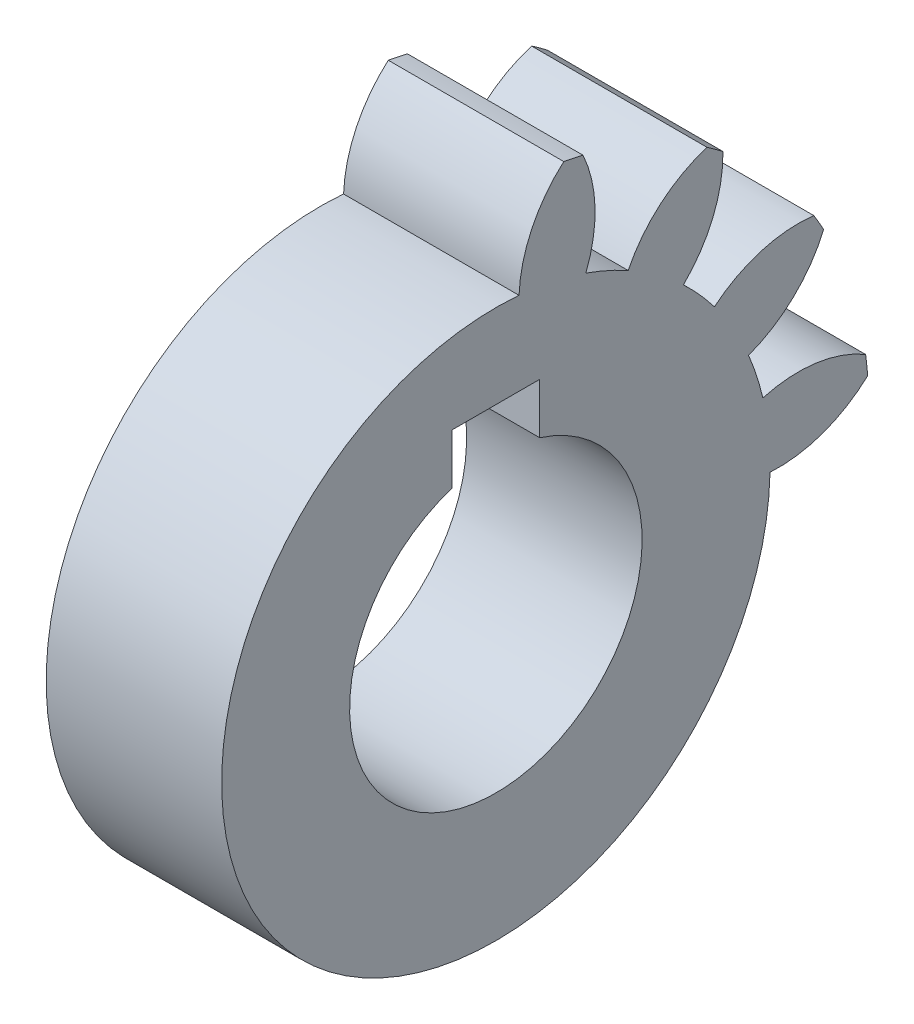
ISO-10303-21;
HEADER;
FILE_DESCRIPTION(('STEP AP214'),'2;1');
FILE_NAME('part.step','',(''),(''),'','','');
FILE_SCHEMA(('AUTOMOTIVE_DESIGN { 1 0 10303 214 1 1 1 1 }'));
ENDSEC;
DATA;
#1=APPLICATION_CONTEXT('core data for automotive mechanical design processes');
#2=APPLICATION_PROTOCOL_DEFINITION('international standard','automotive_design',2000,#1);
#3=PRODUCT_CONTEXT('',#1,'mechanical');
#4=PRODUCT('Part','Part','',(#3));
#5=PRODUCT_RELATED_PRODUCT_CATEGORY('part','',(#4));
#6=PRODUCT_DEFINITION_FORMATION('','',#4);
#7=PRODUCT_DEFINITION_CONTEXT('part definition',#1,'design');
#8=PRODUCT_DEFINITION('design','',#6,#7);
#9=PRODUCT_DEFINITION_SHAPE('','',#8);
#10=(LENGTH_UNIT() NAMED_UNIT(*) SI_UNIT(.MILLI.,.METRE.));
#11=(NAMED_UNIT(*) PLANE_ANGLE_UNIT() SI_UNIT($,.RADIAN.));
#12=(NAMED_UNIT(*) SI_UNIT($,.STERADIAN.) SOLID_ANGLE_UNIT());
#13=UNCERTAINTY_MEASURE_WITH_UNIT(LENGTH_MEASURE(1.E-05),#10,'distance_accuracy_value','');
#14=(GEOMETRIC_REPRESENTATION_CONTEXT(3) GLOBAL_UNCERTAINTY_ASSIGNED_CONTEXT((#13)) GLOBAL_UNIT_ASSIGNED_CONTEXT((#10,
#11,#12)) REPRESENTATION_CONTEXT('',''));
#15=CARTESIAN_POINT('',(0.,0.,0.));
#16=DIRECTION('',(0.,0.,1.));
#17=DIRECTION('',(1.,0.,0.));
#18=AXIS2_PLACEMENT_3D('',#15,#16,#17);
#19=CARTESIAN_POINT('',(12.,0.,0.));
#20=DIRECTION('',(-1.,0.,0.));
#21=DIRECTION('',(0.,0.,1.));
#22=AXIS2_PLACEMENT_3D('',#19,#20,#21);
#23=PLANE('',#22);
#24=CARTESIAN_POINT('',(12.,0.,0.));
#25=DIRECTION('',(-1.,0.,0.));
#26=DIRECTION('',(0.,0.,-1.));
#27=AXIS2_PLACEMENT_3D('',#24,#25,#26);
#28=CIRCLE('',#27,18.7490000000188);
#29=CARTESIAN_POINT('',(12.,-0.376878329068281,-18.7452117546264));
#30=VERTEX_POINT('',#29);
#31=CARTESIAN_POINT('',(12.,18.681918035867,-1.58459442818945));
#32=VERTEX_POINT('',#31);
#33=EDGE_CURVE('E276',#30,#32,#28,.T.);
#34=ORIENTED_EDGE('',*,*,#33,.F.);
#35=CARTESIAN_POINT('',(12.,8.60521268905633,-19.3126982674945));
#36=DIRECTION('',(-1.,0.,0.));
#37=DIRECTION('',(0.,-0.994521895368274,0.104528463267644));
#38=AXIS2_PLACEMENT_3D('',#35,#36,#37);
#39=CIRCLE('',#38,9.000000000009);
#40=CARTESIAN_POINT('',(12.,1.99616591323329,-25.4217489887723));
#41=VERTEX_POINT('',#40);
#42=EDGE_CURVE('E237',#41,#30,#39,.T.);
#43=ORIENTED_EDGE('',*,*,#42,.F.);
#44=CARTESIAN_POINT('',(12.,0.,0.));
#45=DIRECTION('',(-1.,0.,0.));
#46=DIRECTION('',(0.,0.,1.));
#47=AXIS2_PLACEMENT_3D('',#44,#45,#46);
#48=CIRCLE('',#47,25.5000000000255);
#49=CARTESIAN_POINT('',(12.,3.33293391710508,-25.2812490099977));
#50=VERTEX_POINT('',#49);
#51=EDGE_CURVE('E291',#50,#41,#48,.T.);
#52=ORIENTED_EDGE('',*,*,#51,.F.);
#53=CARTESIAN_POINT('',(12.,-4.40183239455614,-20.6797937940739));
#54=DIRECTION('',(-1.,0.,0.));
#55=DIRECTION('',(0.,-0.95105651629515,-0.309016994374957));
#56=AXIS2_PLACEMENT_3D('',#53,#54,#55);
#57=CIRCLE('',#56,9.000000000009);
#58=CARTESIAN_POINT('',(12.,4.26599130398838,-18.2572264924056));
#59=VERTEX_POINT('',#58);
#60=EDGE_CURVE('E245',#59,#50,#57,.T.);
#61=ORIENTED_EDGE('',*,*,#60,.F.);
#62=CARTESIAN_POINT('',(12.,0.,0.));
#63=DIRECTION('',(-1.,0.,0.));
#64=DIRECTION('',(0.,-0.95105651629515,-0.309016994374957));
#65=AXIS2_PLACEMENT_3D('',#62,#63,#64);
#66=CIRCLE('',#65,18.7490000000188);
#67=CARTESIAN_POINT('',(12.,7.2800690172175,-17.2778932774008));
#68=VERTEX_POINT('',#67);
#69=EDGE_CURVE('E250',#68,#59,#66,.T.);
#70=ORIENTED_EDGE('',*,*,#69,.F.);
#71=CARTESIAN_POINT('',(12.,15.7164350261924,-14.1429724549917));
#72=DIRECTION('',(-1.,0.,0.));
#73=DIRECTION('',(0.,-0.95105651629515,-0.309016994374957));
#74=AXIS2_PLACEMENT_3D('',#71,#72,#73);
#75=CIRCLE('',#74,9.000000000009);
#76=CARTESIAN_POINT('',(12.,12.1635451475441,-22.4120094914525));
#77=VERTEX_POINT('',#76);
#78=EDGE_CURVE('E247',#77,#68,#75,.T.);
#79=ORIENTED_EDGE('',*,*,#78,.F.);
#80=CARTESIAN_POINT('',(12.,13.3275969956842,-21.7399438435781));
#81=VERTEX_POINT('',#80);
#82=EDGE_CURVE('E356',#81,#77,#48,.T.);
#83=ORIENTED_EDGE('',*,*,#82,.F.);
#84=CARTESIAN_POINT('',(12.,4.3899559179506,-20.6823182171059));
#85=DIRECTION('',(-1.,0.,0.));
#86=DIRECTION('',(0.,-0.743144825477386,-0.669130606358867));
#87=AXIS2_PLACEMENT_3D('',#84,#85,#86);
#88=CIRCLE('',#87,9.000000000009);
#89=CARTESIAN_POINT('',(12.,11.3230599934971,-14.9436713489145));
#90=VERTEX_POINT('',#89);
#91=EDGE_CURVE('E222',#90,#81,#88,.T.);
#92=ORIENTED_EDGE('',*,*,#91,.F.);
#93=CARTESIAN_POINT('',(12.,0.,0.));
#94=DIRECTION('',(-1.,0.,0.));
#95=DIRECTION('',(0.,-0.743144825477386,-0.669130606358867));
#96=AXIS2_PLACEMENT_3D('',#93,#94,#95);
#97=CIRCLE('',#96,18.7490000000188);
#98=CARTESIAN_POINT('',(12.,13.6782262930757,-12.82307008778));
#99=VERTEX_POINT('',#98);
#100=EDGE_CURVE('E227',#99,#90,#97,.T.);
#101=ORIENTED_EDGE('',*,*,#100,.F.);
#102=CARTESIAN_POINT('',(12.,20.11014296797,-6.52779822014959));
#103=DIRECTION('',(-1.,0.,0.));
#104=DIRECTION('',(0.,-0.743144825477386,-0.669130606358867));
#105=AXIS2_PLACEMENT_3D('',#102,#103,#104);
#106=CIRCLE('',#105,9.000000000009);
#107=CARTESIAN_POINT('',(12.,20.227736923506,-15.5270299463462));
#108=VERTEX_POINT('',#107);
#109=EDGE_CURVE('E224',#108,#99,#106,.T.);
#110=ORIENTED_EDGE('',*,*,#109,.F.);
#111=CARTESIAN_POINT('',(12.,21.0177974762919,-14.4396048854143));
#112=VERTEX_POINT('',#111);
#113=EDGE_CURVE('E297',#112,#108,#48,.T.);
#114=ORIENTED_EDGE('',*,*,#113,.F.);
#115=CARTESIAN_POINT('',(12.,12.4226809707462,-17.1086819274379));
#116=DIRECTION('',(-1.,0.,0.));
#117=DIRECTION('',(0.,-0.406736643075789,-0.913545457642606));
#118=AXIS2_PLACEMENT_3D('',#115,#116,#117);
#119=CIRCLE('',#118,9.000000000009);
#120=CARTESIAN_POINT('',(12.,16.4222687433594,-9.04621967020385));
#121=VERTEX_POINT('',#120);
#122=EDGE_CURVE('E206',#121,#112,#119,.T.);
#123=ORIENTED_EDGE('',*,*,#122,.F.);
#124=CARTESIAN_POINT('',(12.,0.,0.));
#125=DIRECTION('',(-1.,0.,0.));
#126=DIRECTION('',(0.,-0.406736643075789,-0.913545457642606));
#127=AXIS2_PLACEMENT_3D('',#124,#125,#126);
#128=CIRCLE('',#127,18.7490000000188);
#129=CARTESIAN_POINT('',(12.,17.7112939800762,-6.15102158604734));
#130=VERTEX_POINT('',#129);
#131=EDGE_CURVE('E211',#130,#121,#128,.T.);
#132=ORIENTED_EDGE('',*,*,#131,.F.);
#133=CARTESIAN_POINT('',(12.,21.0266244956721,2.21609163014142));
#134=DIRECTION('',(-1.,0.,0.));
#135=DIRECTION('',(0.,-0.406736643075789,-0.913545457642606));
#136=AXIS2_PLACEMENT_3D('',#133,#134,#135);
#137=CIRCLE('',#136,9.000000000009);
#138=CARTESIAN_POINT('',(12.,24.7943692221727,-5.95728586487793));
#139=VERTEX_POINT('',#138);
#140=EDGE_CURVE('E208',#139,#130,#137,.T.);
#141=ORIENTED_EDGE('',*,*,#140,.F.);
#142=CARTESIAN_POINT('',(12.,25.0738298325528,-4.64252706287045));
#143=VERTEX_POINT('',#142);
#144=EDGE_CURVE('E293',#143,#139,#48,.T.);
#145=ORIENTED_EDGE('',*,*,#144,.F.);
#146=CARTESIAN_POINT('',(12.,18.3074116271859,-10.5767991050203));
#147=DIRECTION('',(-1.,0.,0.));
#148=DIRECTION('',(0.,0.,-1.));
#149=AXIS2_PLACEMENT_3D('',#146,#147,#148);
#150=CIRCLE('',#149,9.000000000009);
#151=EDGE_CURVE('E274',#32,#143,#150,.T.);
#152=ORIENTED_EDGE('',*,*,#151,.F.);
#153=EDGE_LOOP('',(#34,#43,#52,#61,#70,#79,#83,#92,#101,#110,#114,#123,#132,#141,#145,#152));
#154=FACE_BOUND('',#153,.T.);
#155=DIRECTION('',(0.,1.,0.));
#156=VECTOR('',#155,1.);
#157=CARTESIAN_POINT('',(12.,7.,-3.));
#158=LINE('',#157,#156);
#159=CARTESIAN_POINT('',(12.,9.53939201416946,-3.));
#160=VERTEX_POINT('',#159);
#161=CARTESIAN_POINT('',(12.,13.,-3.));
#162=VERTEX_POINT('',#161);
#163=EDGE_CURVE('E175',#160,#162,#158,.T.);
#164=ORIENTED_EDGE('',*,*,#163,.F.);
#165=CARTESIAN_POINT('',(12.,0.,0.));
#166=DIRECTION('',(-1.,0.,0.));
#167=DIRECTION('',(0.,0.,1.));
#168=AXIS2_PLACEMENT_3D('',#165,#166,#167);
#169=CIRCLE('',#168,10.);
#170=CARTESIAN_POINT('',(12.,9.53939201416946,3.));
#171=VERTEX_POINT('',#170);
#172=EDGE_CURVE('E203',#171,#160,#169,.F.);
#173=ORIENTED_EDGE('',*,*,#172,.F.);
#174=DIRECTION('',(0.,-1.,0.));
#175=VECTOR('',#174,1.);
#176=CARTESIAN_POINT('',(12.,7.,3.));
#177=LINE('',#176,#175);
#178=CARTESIAN_POINT('',(12.,13.,3.));
#179=VERTEX_POINT('',#178);
#180=EDGE_CURVE('E51',#179,#171,#177,.T.);
#181=ORIENTED_EDGE('',*,*,#180,.F.);
#182=DIRECTION('',(0.,0.,1.));
#183=VECTOR('',#182,1.);
#184=CARTESIAN_POINT('',(12.,13.,3.));
#185=LINE('',#184,#183);
#186=EDGE_CURVE('E184',#162,#179,#185,.T.);
#187=ORIENTED_EDGE('',*,*,#186,.F.);
#188=EDGE_LOOP('',(#164,#173,#181,#187));
#189=FACE_BOUND('',#188,.T.);
#190=ADVANCED_FACE('F37',(#154,#189),#23,.F.);
#191=CARTESIAN_POINT('',(0.,0.,0.));
#192=DIRECTION('',(1.,0.,0.));
#193=DIRECTION('',(0.,0.,-1.));
#194=AXIS2_PLACEMENT_3D('',#191,#192,#193);
#195=PLANE('',#194);
#196=CARTESIAN_POINT('',(0.,8.60521268905633,-19.3126982674945));
#197=DIRECTION('',(1.,0.,0.));
#198=DIRECTION('',(0.,0.,-1.));
#199=AXIS2_PLACEMENT_3D('',#196,#197,#198);
#200=CIRCLE('',#199,9.000000000009);
#201=CARTESIAN_POINT('',(0.,-0.376878329068281,-18.7452117546264));
#202=VERTEX_POINT('',#201);
#203=CARTESIAN_POINT('',(0.,1.99616591323329,-25.4217489887723));
#204=VERTEX_POINT('',#203);
#205=EDGE_CURVE('E296',#202,#204,#200,.T.);
#206=ORIENTED_EDGE('',*,*,#205,.F.);
#207=CARTESIAN_POINT('',(0.,0.,0.));
#208=DIRECTION('',(-1.,0.,0.));
#209=DIRECTION('',(0.,0.,-1.));
#210=AXIS2_PLACEMENT_3D('',#207,#208,#209);
#211=CIRCLE('',#210,18.7490000000188);
#212=CARTESIAN_POINT('',(0.,18.681918035867,-1.58459442818945));
#213=VERTEX_POINT('',#212);
#214=EDGE_CURVE('E277',#202,#213,#211,.T.);
#215=ORIENTED_EDGE('',*,*,#214,.T.);
#216=CARTESIAN_POINT('',(0.,18.3074116271859,-10.5767991050203));
#217=DIRECTION('',(-1.,0.,0.));
#218=DIRECTION('',(0.,0.,-1.));
#219=AXIS2_PLACEMENT_3D('',#216,#217,#218);
#220=CIRCLE('',#219,9.000000000009);
#221=CARTESIAN_POINT('',(0.,25.0738298325528,-4.64252706287046));
#222=VERTEX_POINT('',#221);
#223=EDGE_CURVE('E273',#213,#222,#220,.T.);
#224=ORIENTED_EDGE('',*,*,#223,.T.);
#225=CARTESIAN_POINT('',(0.,0.,0.));
#226=DIRECTION('',(-1.,0.,0.));
#227=DIRECTION('',(0.,0.,1.));
#228=AXIS2_PLACEMENT_3D('',#225,#226,#227);
#229=CIRCLE('',#228,25.5000000000255);
#230=CARTESIAN_POINT('',(0.,24.7943692221727,-5.95728586487793));
#231=VERTEX_POINT('',#230);
#232=EDGE_CURVE('E288',#222,#231,#229,.T.);
#233=ORIENTED_EDGE('',*,*,#232,.T.);
#234=CARTESIAN_POINT('',(0.,21.0266244956721,2.21609163014142));
#235=DIRECTION('',(1.,0.,0.));
#236=DIRECTION('',(0.,0.,-1.));
#237=AXIS2_PLACEMENT_3D('',#234,#235,#236);
#238=CIRCLE('',#237,9.000000000009);
#239=CARTESIAN_POINT('',(0.,17.7112939800762,-6.15102158604734));
#240=VERTEX_POINT('',#239);
#241=EDGE_CURVE('E301',#240,#231,#238,.T.);
#242=ORIENTED_EDGE('',*,*,#241,.F.);
#243=CARTESIAN_POINT('',(0.,0.,0.));
#244=DIRECTION('',(-1.,0.,0.));
#245=DIRECTION('',(0.,-0.406736643075789,-0.913545457642606));
#246=AXIS2_PLACEMENT_3D('',#243,#244,#245);
#247=CIRCLE('',#246,18.7490000000188);
#248=CARTESIAN_POINT('',(0.,16.4222687433594,-9.04621967020384));
#249=VERTEX_POINT('',#248);
#250=EDGE_CURVE('E209',#240,#249,#247,.T.);
#251=ORIENTED_EDGE('',*,*,#250,.T.);
#252=CARTESIAN_POINT('',(0.,12.4226809707462,-17.1086819274379));
#253=DIRECTION('',(-1.,0.,0.));
#254=DIRECTION('',(0.,-0.406736643075789,-0.913545457642606));
#255=AXIS2_PLACEMENT_3D('',#252,#253,#254);
#256=CIRCLE('',#255,9.000000000009);
#257=CARTESIAN_POINT('',(0.,21.0177974762919,-14.4396048854143));
#258=VERTEX_POINT('',#257);
#259=EDGE_CURVE('E205',#249,#258,#256,.T.);
#260=ORIENTED_EDGE('',*,*,#259,.T.);
#261=CARTESIAN_POINT('',(0.,20.227736923506,-15.5270299463462));
#262=VERTEX_POINT('',#261);
#263=EDGE_CURVE('E292',#258,#262,#229,.T.);
#264=ORIENTED_EDGE('',*,*,#263,.T.);
#265=CARTESIAN_POINT('',(0.,20.11014296797,-6.52779822014959));
#266=DIRECTION('',(1.,0.,0.));
#267=DIRECTION('',(0.,0.,-1.));
#268=AXIS2_PLACEMENT_3D('',#265,#266,#267);
#269=CIRCLE('',#268,9.000000000009);
#270=CARTESIAN_POINT('',(0.,13.6782262930757,-12.82307008778));
#271=VERTEX_POINT('',#270);
#272=EDGE_CURVE('E303',#271,#262,#269,.T.);
#273=ORIENTED_EDGE('',*,*,#272,.F.);
#274=CARTESIAN_POINT('',(0.,0.,0.));
#275=DIRECTION('',(-1.,0.,0.));
#276=DIRECTION('',(0.,-0.743144825477386,-0.669130606358867));
#277=AXIS2_PLACEMENT_3D('',#274,#275,#276);
#278=CIRCLE('',#277,18.7490000000188);
#279=CARTESIAN_POINT('',(0.,11.3230599934971,-14.9436713489145));
#280=VERTEX_POINT('',#279);
#281=EDGE_CURVE('E225',#271,#280,#278,.T.);
#282=ORIENTED_EDGE('',*,*,#281,.T.);
#283=CARTESIAN_POINT('',(0.,4.3899559179506,-20.6823182171059));
#284=DIRECTION('',(-1.,0.,0.));
#285=DIRECTION('',(0.,-0.743144825477386,-0.669130606358867));
#286=AXIS2_PLACEMENT_3D('',#283,#284,#285);
#287=CIRCLE('',#286,9.000000000009);
#288=CARTESIAN_POINT('',(0.,13.3275969956842,-21.7399438435781));
#289=VERTEX_POINT('',#288);
#290=EDGE_CURVE('E59',#280,#289,#287,.T.);
#291=ORIENTED_EDGE('',*,*,#290,.T.);
#292=CARTESIAN_POINT('',(0.,12.1635451475442,-22.4120094914525));
#293=VERTEX_POINT('',#292);
#294=EDGE_CURVE('E378',#289,#293,#229,.T.);
#295=ORIENTED_EDGE('',*,*,#294,.T.);
#296=CARTESIAN_POINT('',(0.,15.7164350261924,-14.1429724549917));
#297=DIRECTION('',(1.,0.,0.));
#298=DIRECTION('',(0.,0.,-1.));
#299=AXIS2_PLACEMENT_3D('',#296,#297,#298);
#300=CIRCLE('',#299,9.000000000009);
#301=CARTESIAN_POINT('',(0.,7.2800690172175,-17.2778932774008));
#302=VERTEX_POINT('',#301);
#303=EDGE_CURVE('E299',#302,#293,#300,.T.);
#304=ORIENTED_EDGE('',*,*,#303,.F.);
#305=CARTESIAN_POINT('',(0.,0.,0.));
#306=DIRECTION('',(-1.,0.,0.));
#307=DIRECTION('',(0.,-0.95105651629515,-0.309016994374957));
#308=AXIS2_PLACEMENT_3D('',#305,#306,#307);
#309=CIRCLE('',#308,18.7490000000188);
#310=CARTESIAN_POINT('',(0.,4.26599130398838,-18.2572264924056));
#311=VERTEX_POINT('',#310);
#312=EDGE_CURVE('E248',#302,#311,#309,.T.);
#313=ORIENTED_EDGE('',*,*,#312,.T.);
#314=CARTESIAN_POINT('',(0.,-4.40183239455614,-20.6797937940739));
#315=DIRECTION('',(-1.,0.,0.));
#316=DIRECTION('',(0.,-0.95105651629515,-0.309016994374957));
#317=AXIS2_PLACEMENT_3D('',#314,#315,#316);
#318=CIRCLE('',#317,9.000000000009);
#319=CARTESIAN_POINT('',(0.,3.33293391710508,-25.2812490099977));
#320=VERTEX_POINT('',#319);
#321=EDGE_CURVE('E236',#311,#320,#318,.T.);
#322=ORIENTED_EDGE('',*,*,#321,.T.);
#323=EDGE_CURVE('E287',#320,#204,#229,.T.);
#324=ORIENTED_EDGE('',*,*,#323,.T.);
#325=EDGE_LOOP('',(#206,#215,#224,#233,#242,#251,#260,#264,#273,#282,#291,#295,#304,#313,#322,#324));
#326=FACE_BOUND('',#325,.T.);
#327=DIRECTION('',(0.,1.,0.));
#328=VECTOR('',#327,1.);
#329=CARTESIAN_POINT('',(0.,7.,-3.));
#330=LINE('',#329,#328);
#331=CARTESIAN_POINT('',(0.,9.53939201416946,-3.));
#332=VERTEX_POINT('',#331);
#333=CARTESIAN_POINT('',(0.,13.,-3.));
#334=VERTEX_POINT('',#333);
#335=EDGE_CURVE('E197',#332,#334,#330,.T.);
#336=ORIENTED_EDGE('',*,*,#335,.T.);
#337=DIRECTION('',(0.,0.,1.));
#338=VECTOR('',#337,1.);
#339=CARTESIAN_POINT('',(0.,13.,3.));
#340=LINE('',#339,#338);
#341=CARTESIAN_POINT('',(0.,13.,3.));
#342=VERTEX_POINT('',#341);
#343=EDGE_CURVE('E190',#334,#342,#340,.T.);
#344=ORIENTED_EDGE('',*,*,#343,.T.);
#345=DIRECTION('',(0.,-1.,0.));
#346=VECTOR('',#345,1.);
#347=CARTESIAN_POINT('',(0.,7.,3.));
#348=LINE('',#347,#346);
#349=CARTESIAN_POINT('',(0.,9.53939201416946,3.));
#350=VERTEX_POINT('',#349);
#351=EDGE_CURVE('E185',#342,#350,#348,.T.);
#352=ORIENTED_EDGE('',*,*,#351,.T.);
#353=CARTESIAN_POINT('',(0.,0.,0.));
#354=DIRECTION('',(1.,0.,0.));
#355=DIRECTION('',(0.,0.,-1.));
#356=AXIS2_PLACEMENT_3D('',#353,#354,#355);
#357=CIRCLE('',#356,10.);
#358=EDGE_CURVE('E191',#332,#350,#357,.F.);
#359=ORIENTED_EDGE('',*,*,#358,.F.);
#360=EDGE_LOOP('',(#336,#344,#352,#359));
#361=FACE_BOUND('',#360,.T.);
#362=ADVANCED_FACE('F312',(#326,#361),#195,.F.);
#363=CARTESIAN_POINT('',(50.0000508,0.,0.));
#364=DIRECTION('',(-1.,0.,0.));
#365=DIRECTION('',(0.,0.,1.));
#366=AXIS2_PLACEMENT_3D('',#363,#364,#365);
#367=CYLINDRICAL_SURFACE('',#366,10.);
#368=ORIENTED_EDGE('',*,*,#172,.T.);
#369=DIRECTION('',(-1.,0.,0.));
#370=VECTOR('',#369,1.);
#371=CARTESIAN_POINT('',(50.0000508,9.53939201416946,-3.));
#372=LINE('',#371,#370);
#373=EDGE_CURVE('E11',#160,#332,#372,.T.);
#374=ORIENTED_EDGE('',*,*,#373,.T.);
#375=ORIENTED_EDGE('',*,*,#358,.T.);
#376=DIRECTION('',(-1.,0.,0.));
#377=VECTOR('',#376,1.);
#378=CARTESIAN_POINT('',(50.0000508,9.53939201416946,3.));
#379=LINE('',#378,#377);
#380=EDGE_CURVE('E44',#350,#171,#379,.F.);
#381=ORIENTED_EDGE('',*,*,#380,.T.);
#382=EDGE_LOOP('',(#368,#374,#375,#381));
#383=FACE_BOUND('',#382,.T.);
#384=ADVANCED_FACE('F307',(#383),#367,.F.);
#385=CARTESIAN_POINT('',(-10.,0.,0.));
#386=DIRECTION('',(-1.,0.,0.));
#387=DIRECTION('',(0.,0.,1.));
#388=AXIS2_PLACEMENT_3D('',#385,#386,#387);
#389=CYLINDRICAL_SURFACE('',#388,25.5000000000255);
#390=DIRECTION('',(-1.,0.,0.));
#391=VECTOR('',#390,1.);
#392=CARTESIAN_POINT('',(6.,13.3275969956842,-21.7399438435781));
#393=LINE('',#392,#391);
#394=EDGE_CURVE('E271',#81,#289,#393,.T.);
#395=ORIENTED_EDGE('',*,*,#394,.F.);
#396=ORIENTED_EDGE('',*,*,#82,.T.);
#397=DIRECTION('',(-1.,0.,0.));
#398=VECTOR('',#397,1.);
#399=CARTESIAN_POINT('',(6.,12.1635451475442,-22.4120094914525));
#400=LINE('',#399,#398);
#401=EDGE_CURVE('E261',#293,#77,#400,.F.);
#402=ORIENTED_EDGE('',*,*,#401,.F.);
#403=ORIENTED_EDGE('',*,*,#294,.F.);
#404=EDGE_LOOP('',(#395,#396,#402,#403));
#405=FACE_BOUND('',#404,.T.);
#406=ADVANCED_FACE('F320',(#405),#389,.T.);
#407=DIRECTION('',(-1.,0.,0.));
#408=VECTOR('',#407,1.);
#409=CARTESIAN_POINT('',(6.,20.227736923506,-15.5270299463462));
#410=LINE('',#409,#408);
#411=EDGE_CURVE('E269',#262,#108,#410,.F.);
#412=ORIENTED_EDGE('',*,*,#411,.F.);
#413=ORIENTED_EDGE('',*,*,#263,.F.);
#414=DIRECTION('',(-1.,0.,0.));
#415=VECTOR('',#414,1.);
#416=CARTESIAN_POINT('',(6.,21.0177974762919,-14.4396048854143));
#417=LINE('',#416,#415);
#418=EDGE_CURVE('E267',#112,#258,#417,.T.);
#419=ORIENTED_EDGE('',*,*,#418,.F.);
#420=ORIENTED_EDGE('',*,*,#113,.T.);
#421=EDGE_LOOP('',(#412,#413,#419,#420));
#422=FACE_BOUND('',#421,.T.);
#423=ADVANCED_FACE('F328',(#422),#389,.T.);
#424=DIRECTION('',(-1.,0.,0.));
#425=VECTOR('',#424,1.);
#426=CARTESIAN_POINT('',(6.,24.7943692221727,-5.95728586487793));
#427=LINE('',#426,#425);
#428=EDGE_CURVE('E265',#231,#139,#427,.F.);
#429=ORIENTED_EDGE('',*,*,#428,.F.);
#430=ORIENTED_EDGE('',*,*,#232,.F.);
#431=DIRECTION('',(-1.,0.,0.));
#432=VECTOR('',#431,1.);
#433=CARTESIAN_POINT('',(6.,25.0738298325528,-4.64252706287046));
#434=LINE('',#433,#432);
#435=EDGE_CURVE('E285',#143,#222,#434,.T.);
#436=ORIENTED_EDGE('',*,*,#435,.F.);
#437=ORIENTED_EDGE('',*,*,#144,.T.);
#438=EDGE_LOOP('',(#429,#430,#436,#437));
#439=FACE_BOUND('',#438,.T.);
#440=ADVANCED_FACE('F334',(#439),#389,.T.);
#441=DIRECTION('',(-1.,0.,0.));
#442=VECTOR('',#441,1.);
#443=CARTESIAN_POINT('',(6.,3.33293391710508,-25.2812490099977));
#444=LINE('',#443,#442);
#445=EDGE_CURVE('E263',#50,#320,#444,.T.);
#446=ORIENTED_EDGE('',*,*,#445,.F.);
#447=ORIENTED_EDGE('',*,*,#51,.T.);
#448=DIRECTION('',(-1.,0.,0.));
#449=VECTOR('',#448,1.);
#450=CARTESIAN_POINT('',(6.,1.99616591323329,-25.4217489887723));
#451=LINE('',#450,#449);
#452=EDGE_CURVE('E244',#204,#41,#451,.F.);
#453=ORIENTED_EDGE('',*,*,#452,.F.);
#454=ORIENTED_EDGE('',*,*,#323,.F.);
#455=EDGE_LOOP('',(#446,#447,#453,#454));
#456=FACE_BOUND('',#455,.T.);
#457=ADVANCED_FACE('F330',(#456),#389,.T.);
#458=CARTESIAN_POINT('',(12.,18.3074116271859,-10.5767991050203));
#459=DIRECTION('',(-1.,0.,0.));
#460=DIRECTION('',(0.,0.,1.));
#461=AXIS2_PLACEMENT_3D('',#458,#459,#460);
#462=CYLINDRICAL_SURFACE('',#461,9.000000000009);
#463=ORIENTED_EDGE('',*,*,#435,.T.);
#464=ORIENTED_EDGE('',*,*,#223,.F.);
#465=DIRECTION('',(-1.,0.,0.));
#466=VECTOR('',#465,1.);
#467=CARTESIAN_POINT('',(12.,18.681918035867,-1.58459442818945));
#468=LINE('',#467,#466);
#469=EDGE_CURVE('E279',#32,#213,#468,.T.);
#470=ORIENTED_EDGE('',*,*,#469,.F.);
#471=ORIENTED_EDGE('',*,*,#151,.T.);
#472=EDGE_LOOP('',(#463,#464,#470,#471));
#473=FACE_BOUND('',#472,.T.);
#474=ADVANCED_FACE('F325',(#473),#462,.T.);
#475=CARTESIAN_POINT('',(12.,0.,0.));
#476=DIRECTION('',(-1.,0.,0.));
#477=DIRECTION('',(0.,0.,1.));
#478=AXIS2_PLACEMENT_3D('',#475,#476,#477);
#479=CYLINDRICAL_SURFACE('',#478,18.7490000000188);
#480=ORIENTED_EDGE('',*,*,#33,.T.);
#481=ORIENTED_EDGE('',*,*,#469,.T.);
#482=ORIENTED_EDGE('',*,*,#214,.F.);
#483=DIRECTION('',(-1.,0.,0.));
#484=VECTOR('',#483,1.);
#485=CARTESIAN_POINT('',(12.,-0.376878329068281,-18.7452117546264));
#486=LINE('',#485,#484);
#487=EDGE_CURVE('E240',#30,#202,#486,.T.);
#488=ORIENTED_EDGE('',*,*,#487,.F.);
#489=EDGE_LOOP('',(#480,#481,#482,#488));
#490=FACE_BOUND('',#489,.T.);
#491=ADVANCED_FACE('F343',(#490),#479,.T.);
#492=CARTESIAN_POINT('',(12.,8.60521268905633,-19.3126982674945));
#493=DIRECTION('',(-1.,0.,0.));
#494=DIRECTION('',(0.,0.,1.));
#495=AXIS2_PLACEMENT_3D('',#492,#493,#494);
#496=CYLINDRICAL_SURFACE('',#495,9.000000000009);
#497=ORIENTED_EDGE('',*,*,#452,.T.);
#498=ORIENTED_EDGE('',*,*,#42,.T.);
#499=ORIENTED_EDGE('',*,*,#487,.T.);
#500=ORIENTED_EDGE('',*,*,#205,.T.);
#501=EDGE_LOOP('',(#497,#498,#499,#500));
#502=FACE_BOUND('',#501,.T.);
#503=ADVANCED_FACE('F405',(#502),#496,.T.);
#504=CARTESIAN_POINT('',(12.,-4.40183239455614,-20.6797937940739));
#505=DIRECTION('',(-1.,0.,0.));
#506=DIRECTION('',(0.,0.,1.));
#507=AXIS2_PLACEMENT_3D('',#504,#505,#506);
#508=CYLINDRICAL_SURFACE('',#507,9.000000000009);
#509=ORIENTED_EDGE('',*,*,#445,.T.);
#510=ORIENTED_EDGE('',*,*,#321,.F.);
#511=DIRECTION('',(-1.,0.,0.));
#512=VECTOR('',#511,1.);
#513=CARTESIAN_POINT('',(12.,4.26599130398838,-18.2572264924056));
#514=LINE('',#513,#512);
#515=EDGE_CURVE('E252',#59,#311,#514,.T.);
#516=ORIENTED_EDGE('',*,*,#515,.F.);
#517=ORIENTED_EDGE('',*,*,#60,.T.);
#518=EDGE_LOOP('',(#509,#510,#516,#517));
#519=FACE_BOUND('',#518,.T.);
#520=ADVANCED_FACE('F384',(#519),#508,.T.);
#521=CARTESIAN_POINT('',(12.,15.7164350261924,-14.1429724549917));
#522=DIRECTION('',(-1.,0.,0.));
#523=DIRECTION('',(0.,0.,1.));
#524=AXIS2_PLACEMENT_3D('',#521,#522,#523);
#525=CYLINDRICAL_SURFACE('',#524,9.000000000009);
#526=ORIENTED_EDGE('',*,*,#401,.T.);
#527=ORIENTED_EDGE('',*,*,#78,.T.);
#528=DIRECTION('',(-1.,0.,0.));
#529=VECTOR('',#528,1.);
#530=CARTESIAN_POINT('',(12.,7.2800690172175,-17.2778932774008));
#531=LINE('',#530,#529);
#532=EDGE_CURVE('E241',#68,#302,#531,.T.);
#533=ORIENTED_EDGE('',*,*,#532,.T.);
#534=ORIENTED_EDGE('',*,*,#303,.T.);
#535=EDGE_LOOP('',(#526,#527,#533,#534));
#536=FACE_BOUND('',#535,.T.);
#537=ADVANCED_FACE('F390',(#536),#525,.T.);
#538=CARTESIAN_POINT('',(12.,0.,0.));
#539=DIRECTION('',(-1.,0.,0.));
#540=DIRECTION('',(0.,0.,1.));
#541=AXIS2_PLACEMENT_3D('',#538,#539,#540);
#542=CYLINDRICAL_SURFACE('',#541,18.7490000000188);
#543=ORIENTED_EDGE('',*,*,#312,.F.);
#544=ORIENTED_EDGE('',*,*,#532,.F.);
#545=ORIENTED_EDGE('',*,*,#69,.T.);
#546=ORIENTED_EDGE('',*,*,#515,.T.);
#547=EDGE_LOOP('',(#543,#544,#545,#546));
#548=FACE_BOUND('',#547,.T.);
#549=ADVANCED_FACE('F386',(#548),#542,.T.);
#550=CARTESIAN_POINT('',(12.,12.4226809707462,-17.1086819274379));
#551=DIRECTION('',(-1.,0.,0.));
#552=DIRECTION('',(0.,0.,1.));
#553=AXIS2_PLACEMENT_3D('',#550,#551,#552);
#554=CYLINDRICAL_SURFACE('',#553,9.000000000009);
#555=ORIENTED_EDGE('',*,*,#418,.T.);
#556=ORIENTED_EDGE('',*,*,#259,.F.);
#557=DIRECTION('',(-1.,0.,0.));
#558=VECTOR('',#557,1.);
#559=CARTESIAN_POINT('',(12.,16.4222687433594,-9.04621967020385));
#560=LINE('',#559,#558);
#561=EDGE_CURVE('E213',#121,#249,#560,.T.);
#562=ORIENTED_EDGE('',*,*,#561,.F.);
#563=ORIENTED_EDGE('',*,*,#122,.T.);
#564=EDGE_LOOP('',(#555,#556,#562,#563));
#565=FACE_BOUND('',#564,.T.);
#566=ADVANCED_FACE('F411',(#565),#554,.T.);
#567=CARTESIAN_POINT('',(12.,21.0266244956721,2.21609163014142));
#568=DIRECTION('',(-1.,0.,0.));
#569=DIRECTION('',(0.,0.,1.));
#570=AXIS2_PLACEMENT_3D('',#567,#568,#569);
#571=CYLINDRICAL_SURFACE('',#570,9.000000000009);
#572=ORIENTED_EDGE('',*,*,#428,.T.);
#573=ORIENTED_EDGE('',*,*,#140,.T.);
#574=DIRECTION('',(-1.,0.,0.));
#575=VECTOR('',#574,1.);
#576=CARTESIAN_POINT('',(12.,17.7112939800762,-6.15102158604734));
#577=LINE('',#576,#575);
#578=EDGE_CURVE('E220',#130,#240,#577,.T.);
#579=ORIENTED_EDGE('',*,*,#578,.T.);
#580=ORIENTED_EDGE('',*,*,#241,.T.);
#581=EDGE_LOOP('',(#572,#573,#579,#580));
#582=FACE_BOUND('',#581,.T.);
#583=ADVANCED_FACE('F400',(#582),#571,.T.);
#584=CARTESIAN_POINT('',(12.,0.,0.));
#585=DIRECTION('',(-1.,0.,0.));
#586=DIRECTION('',(0.,0.,1.));
#587=AXIS2_PLACEMENT_3D('',#584,#585,#586);
#588=CYLINDRICAL_SURFACE('',#587,18.7490000000188);
#589=ORIENTED_EDGE('',*,*,#250,.F.);
#590=ORIENTED_EDGE('',*,*,#578,.F.);
#591=ORIENTED_EDGE('',*,*,#131,.T.);
#592=ORIENTED_EDGE('',*,*,#561,.T.);
#593=EDGE_LOOP('',(#589,#590,#591,#592));
#594=FACE_BOUND('',#593,.T.);
#595=ADVANCED_FACE('F393',(#594),#588,.T.);
#596=CARTESIAN_POINT('',(12.,4.3899559179506,-20.6823182171059));
#597=DIRECTION('',(-1.,0.,0.));
#598=DIRECTION('',(0.,0.,1.));
#599=AXIS2_PLACEMENT_3D('',#596,#597,#598);
#600=CYLINDRICAL_SURFACE('',#599,9.000000000009);
#601=ORIENTED_EDGE('',*,*,#394,.T.);
#602=ORIENTED_EDGE('',*,*,#290,.F.);
#603=DIRECTION('',(-1.,0.,0.));
#604=VECTOR('',#603,1.);
#605=CARTESIAN_POINT('',(12.,11.3230599934971,-14.9436713489145));
#606=LINE('',#605,#604);
#607=EDGE_CURVE('E229',#90,#280,#606,.T.);
#608=ORIENTED_EDGE('',*,*,#607,.F.);
#609=ORIENTED_EDGE('',*,*,#91,.T.);
#610=EDGE_LOOP('',(#601,#602,#608,#609));
#611=FACE_BOUND('',#610,.T.);
#612=ADVANCED_FACE('F391',(#611),#600,.T.);
#613=CARTESIAN_POINT('',(12.,20.11014296797,-6.52779822014959));
#614=DIRECTION('',(-1.,0.,0.));
#615=DIRECTION('',(0.,0.,1.));
#616=AXIS2_PLACEMENT_3D('',#613,#614,#615);
#617=CYLINDRICAL_SURFACE('',#616,9.000000000009);
#618=ORIENTED_EDGE('',*,*,#411,.T.);
#619=ORIENTED_EDGE('',*,*,#109,.T.);
#620=DIRECTION('',(-1.,0.,0.));
#621=VECTOR('',#620,1.);
#622=CARTESIAN_POINT('',(12.,13.6782262930757,-12.82307008778));
#623=LINE('',#622,#621);
#624=EDGE_CURVE('E234',#99,#271,#623,.T.);
#625=ORIENTED_EDGE('',*,*,#624,.T.);
#626=ORIENTED_EDGE('',*,*,#272,.T.);
#627=EDGE_LOOP('',(#618,#619,#625,#626));
#628=FACE_BOUND('',#627,.T.);
#629=ADVANCED_FACE('F373',(#628),#617,.T.);
#630=CARTESIAN_POINT('',(12.,0.,0.));
#631=DIRECTION('',(-1.,0.,0.));
#632=DIRECTION('',(0.,0.,1.));
#633=AXIS2_PLACEMENT_3D('',#630,#631,#632);
#634=CYLINDRICAL_SURFACE('',#633,18.7490000000188);
#635=ORIENTED_EDGE('',*,*,#281,.F.);
#636=ORIENTED_EDGE('',*,*,#624,.F.);
#637=ORIENTED_EDGE('',*,*,#100,.T.);
#638=ORIENTED_EDGE('',*,*,#607,.T.);
#639=EDGE_LOOP('',(#635,#636,#637,#638));
#640=FACE_BOUND('',#639,.T.);
#641=ADVANCED_FACE('F376',(#640),#634,.T.);
#642=CARTESIAN_POINT('',(12.,7.,-3.));
#643=DIRECTION('',(0.,0.,1.));
#644=DIRECTION('',(1.,0.,0.));
#645=AXIS2_PLACEMENT_3D('',#642,#643,#644);
#646=PLANE('',#645);
#647=ORIENTED_EDGE('',*,*,#163,.T.);
#648=DIRECTION('',(-1.,0.,0.));
#649=VECTOR('',#648,1.);
#650=CARTESIAN_POINT('',(12.,13.,-3.));
#651=LINE('',#650,#649);
#652=EDGE_CURVE('E178',#162,#334,#651,.T.);
#653=ORIENTED_EDGE('',*,*,#652,.T.);
#654=ORIENTED_EDGE('',*,*,#335,.F.);
#655=ORIENTED_EDGE('',*,*,#373,.F.);
#656=EDGE_LOOP('',(#647,#653,#654,#655));
#657=FACE_BOUND('',#656,.T.);
#658=ADVANCED_FACE('F177',(#657),#646,.T.);
#659=CARTESIAN_POINT('',(12.,13.,3.));
#660=DIRECTION('',(0.,-1.,0.));
#661=DIRECTION('',(0.,0.,-1.));
#662=AXIS2_PLACEMENT_3D('',#659,#660,#661);
#663=PLANE('',#662);
#664=ORIENTED_EDGE('',*,*,#343,.F.);
#665=ORIENTED_EDGE('',*,*,#652,.F.);
#666=ORIENTED_EDGE('',*,*,#186,.T.);
#667=DIRECTION('',(-1.,0.,0.));
#668=VECTOR('',#667,1.);
#669=CARTESIAN_POINT('',(12.,13.,3.));
#670=LINE('',#669,#668);
#671=EDGE_CURVE('E192',#179,#342,#670,.T.);
#672=ORIENTED_EDGE('',*,*,#671,.T.);
#673=EDGE_LOOP('',(#664,#665,#666,#672));
#674=FACE_BOUND('',#673,.T.);
#675=ADVANCED_FACE('F188',(#674),#663,.T.);
#676=CARTESIAN_POINT('',(12.,7.,3.));
#677=DIRECTION('',(0.,0.,-1.));
#678=DIRECTION('',(-1.,0.,0.));
#679=AXIS2_PLACEMENT_3D('',#676,#677,#678);
#680=PLANE('',#679);
#681=ORIENTED_EDGE('',*,*,#351,.F.);
#682=ORIENTED_EDGE('',*,*,#671,.F.);
#683=ORIENTED_EDGE('',*,*,#180,.T.);
#684=ORIENTED_EDGE('',*,*,#380,.F.);
#685=EDGE_LOOP('',(#681,#682,#683,#684));
#686=FACE_BOUND('',#685,.T.);
#687=ADVANCED_FACE('F310',(#686),#680,.T.);
#688=CLOSED_SHELL('',(#190,#362,#384,#406,#423,#440,#457,#474,#491,#503,#520,#537,#549,#566,
#583,#595,#612,#629,#641,#658,#675,#687));
#689=MANIFOLD_SOLID_BREP('B2',#688);
#690=ADVANCED_BREP_SHAPE_REPRESENTATION('',(#18,#689),#14);
#691=SHAPE_DEFINITION_REPRESENTATION(#9,#690);
ENDSEC;
END-ISO-10303-21;
